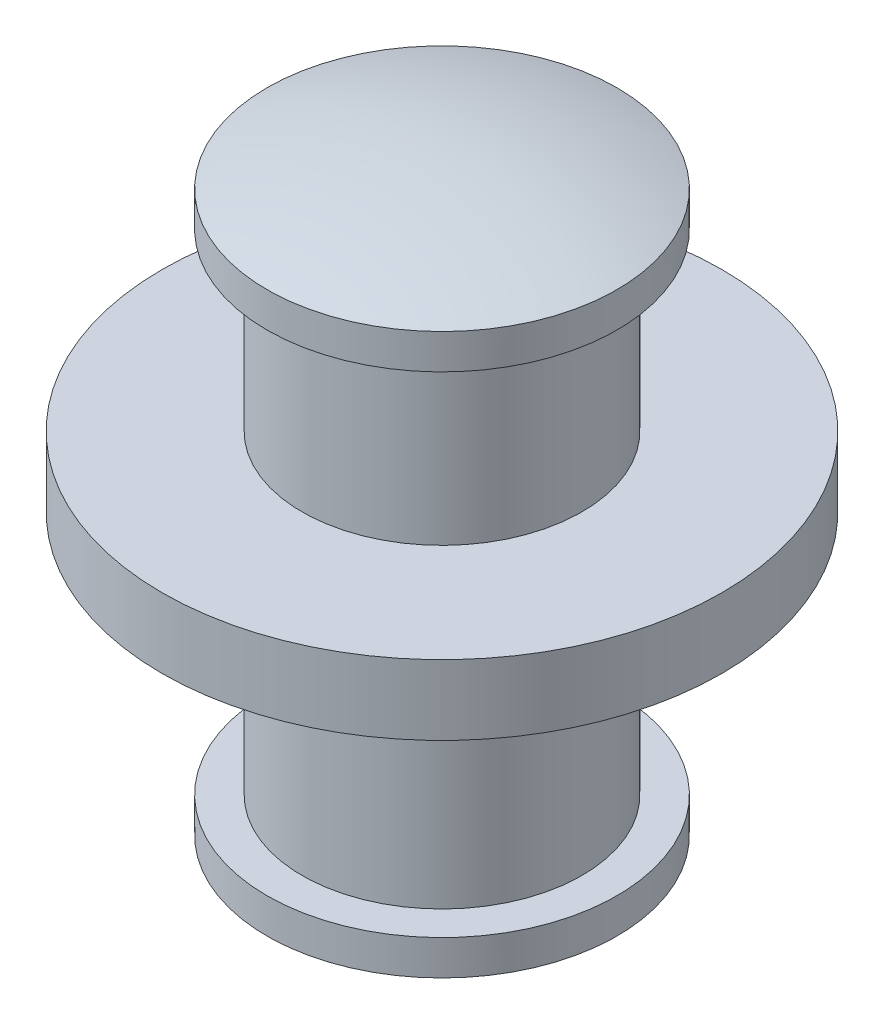
ISO-10303-21;
HEADER;
FILE_DESCRIPTION(('STEP AP214'),'2;1');
FILE_NAME('part.step','',(''),(''),'','','');
FILE_SCHEMA(('AUTOMOTIVE_DESIGN { 1 0 10303 214 1 1 1 1 }'));
ENDSEC;
DATA;
#1=APPLICATION_CONTEXT('core data for automotive mechanical design processes');
#2=APPLICATION_PROTOCOL_DEFINITION('international standard','automotive_design',2000,#1);
#3=PRODUCT_CONTEXT('',#1,'mechanical');
#4=PRODUCT('Part','Part','',(#3));
#5=PRODUCT_RELATED_PRODUCT_CATEGORY('part','',(#4));
#6=PRODUCT_DEFINITION_FORMATION('','',#4);
#7=PRODUCT_DEFINITION_CONTEXT('part definition',#1,'design');
#8=PRODUCT_DEFINITION('design','',#6,#7);
#9=PRODUCT_DEFINITION_SHAPE('','',#8);
#10=(LENGTH_UNIT() NAMED_UNIT(*) SI_UNIT(.MILLI.,.METRE.));
#11=(NAMED_UNIT(*) PLANE_ANGLE_UNIT() SI_UNIT($,.RADIAN.));
#12=(NAMED_UNIT(*) SI_UNIT($,.STERADIAN.) SOLID_ANGLE_UNIT());
#13=UNCERTAINTY_MEASURE_WITH_UNIT(LENGTH_MEASURE(1.E-05),#10,'distance_accuracy_value','');
#14=(GEOMETRIC_REPRESENTATION_CONTEXT(3) GLOBAL_UNCERTAINTY_ASSIGNED_CONTEXT((#13)) GLOBAL_UNIT_ASSIGNED_CONTEXT((#10,
#11,#12)) REPRESENTATION_CONTEXT('',''));
#15=CARTESIAN_POINT('',(0.,0.,0.));
#16=DIRECTION('',(0.,0.,1.));
#17=DIRECTION('',(1.,0.,0.));
#18=AXIS2_PLACEMENT_3D('',#15,#16,#17);
#19=CARTESIAN_POINT('',(0.,0.845081236566722,0.));
#20=DIRECTION('',(0.,-1.,0.));
#21=DIRECTION('',(-1.,0.,0.));
#22=AXIS2_PLACEMENT_3D('',#19,#20,#21);
#23=SPHERICAL_SURFACE('',#22,15.9584323392451);
#24=CARTESIAN_POINT('',(0.,16.,0.));
#25=DIRECTION('',(0.,-1.,0.));
#26=DIRECTION('',(0.,0.,-1.));
#27=AXIS2_PLACEMENT_3D('',#24,#25,#26);
#28=CIRCLE('',#27,5.);
#29=CARTESIAN_POINT('',(0.,16.,-5.));
#30=VERTEX_POINT('',#29);
#31=EDGE_CURVE('E67',#30,#30,#28,.T.);
#32=ORIENTED_EDGE('',*,*,#31,.F.);
#33=EDGE_LOOP('',(#32));
#34=FACE_BOUND('',#33,.T.);
#35=ADVANCED_FACE('F33',(#34),#23,.T.);
#36=CARTESIAN_POINT('',(0.,18.8923845601452,0.));
#37=DIRECTION('',(0.,-1.,0.));
#38=DIRECTION('',(-1.,0.,0.));
#39=AXIS2_PLACEMENT_3D('',#36,#37,#38);
#40=SPHERICAL_SURFACE('',#39,19.5428297431158);
#41=CARTESIAN_POINT('',(0.,0.,0.));
#42=DIRECTION('',(0.,-1.,0.));
#43=DIRECTION('',(0.,0.,-1.));
#44=AXIS2_PLACEMENT_3D('',#41,#42,#43);
#45=CIRCLE('',#44,5.00000000000001);
#46=CARTESIAN_POINT('',(0.,0.,-5.00000000000001));
#47=VERTEX_POINT('',#46);
#48=EDGE_CURVE('E10',#47,#47,#45,.T.);
#49=ORIENTED_EDGE('',*,*,#48,.T.);
#50=EDGE_LOOP('',(#49));
#51=FACE_BOUND('',#50,.T.);
#52=ADVANCED_FACE('F74',(#51),#40,.T.);
#53=CARTESIAN_POINT('',(0.,0.,0.));
#54=DIRECTION('',(0.,-1.,0.));
#55=DIRECTION('',(0.,0.,-1.));
#56=AXIS2_PLACEMENT_3D('',#53,#54,#55);
#57=CYLINDRICAL_SURFACE('',#56,5.00000000000001);
#58=ORIENTED_EDGE('',*,*,#48,.F.);
#59=EDGE_LOOP('',(#58));
#60=FACE_BOUND('',#59,.T.);
#61=CARTESIAN_POINT('',(0.,1.,0.));
#62=DIRECTION('',(0.,-1.,0.));
#63=DIRECTION('',(0.,0.,-1.));
#64=AXIS2_PLACEMENT_3D('',#61,#62,#63);
#65=CIRCLE('',#64,5.00000000000001);
#66=CARTESIAN_POINT('',(0.,1.,-5.00000000000001));
#67=VERTEX_POINT('',#66);
#68=EDGE_CURVE('E39',#67,#67,#65,.T.);
#69=ORIENTED_EDGE('',*,*,#68,.T.);
#70=EDGE_LOOP('',(#69));
#71=FACE_BOUND('',#70,.T.);
#72=ADVANCED_FACE('F78',(#60,#71),#57,.T.);
#73=CARTESIAN_POINT('',(-4.,1.,0.));
#74=DIRECTION('',(0.,-1.,0.));
#75=DIRECTION('',(0.,0.,-1.));
#76=AXIS2_PLACEMENT_3D('',#73,#74,#75);
#77=PLANE('',#76);
#78=ORIENTED_EDGE('',*,*,#68,.F.);
#79=EDGE_LOOP('',(#78));
#80=FACE_BOUND('',#79,.T.);
#81=CARTESIAN_POINT('',(0.,1.,0.));
#82=DIRECTION('',(0.,-1.,0.));
#83=DIRECTION('',(0.,0.,-1.));
#84=AXIS2_PLACEMENT_3D('',#81,#82,#83);
#85=CIRCLE('',#84,4.);
#86=CARTESIAN_POINT('',(0.,1.,-4.));
#87=VERTEX_POINT('',#86);
#88=EDGE_CURVE('E43',#87,#87,#85,.T.);
#89=ORIENTED_EDGE('',*,*,#88,.T.);
#90=EDGE_LOOP('',(#89));
#91=FACE_BOUND('',#90,.T.);
#92=ADVANCED_FACE('F82',(#80,#91),#77,.F.);
#93=CARTESIAN_POINT('',(0.,0.,0.));
#94=DIRECTION('',(0.,-1.,0.));
#95=DIRECTION('',(0.,0.,-1.));
#96=AXIS2_PLACEMENT_3D('',#93,#94,#95);
#97=CYLINDRICAL_SURFACE('',#96,4.);
#98=ORIENTED_EDGE('',*,*,#88,.F.);
#99=EDGE_LOOP('',(#98));
#100=FACE_BOUND('',#99,.T.);
#101=CARTESIAN_POINT('',(0.,8.00000000000001,0.));
#102=DIRECTION('',(0.,-1.,0.));
#103=DIRECTION('',(0.,0.,-1.));
#104=AXIS2_PLACEMENT_3D('',#101,#102,#103);
#105=CIRCLE('',#104,4.);
#106=CARTESIAN_POINT('',(0.,8.00000000000001,-4.));
#107=VERTEX_POINT('',#106);
#108=EDGE_CURVE('E47',#107,#107,#105,.T.);
#109=ORIENTED_EDGE('',*,*,#108,.T.);
#110=EDGE_LOOP('',(#109));
#111=FACE_BOUND('',#110,.T.);
#112=ADVANCED_FACE('F88',(#100,#111),#97,.T.);
#113=CARTESIAN_POINT('',(-8.,8.00000000000001,0.));
#114=DIRECTION('',(0.,1.,0.));
#115=DIRECTION('',(0.,0.,1.));
#116=AXIS2_PLACEMENT_3D('',#113,#114,#115);
#117=PLANE('',#116);
#118=ORIENTED_EDGE('',*,*,#108,.F.);
#119=EDGE_LOOP('',(#118));
#120=FACE_BOUND('',#119,.T.);
#121=CARTESIAN_POINT('',(0.,8.00000000000001,0.));
#122=DIRECTION('',(0.,-1.,0.));
#123=DIRECTION('',(0.,0.,-1.));
#124=AXIS2_PLACEMENT_3D('',#121,#122,#123);
#125=CIRCLE('',#124,8.);
#126=CARTESIAN_POINT('',(0.,8.00000000000001,-8.));
#127=VERTEX_POINT('',#126);
#128=EDGE_CURVE('E52',#127,#127,#125,.T.);
#129=ORIENTED_EDGE('',*,*,#128,.T.);
#130=EDGE_LOOP('',(#129));
#131=FACE_BOUND('',#130,.T.);
#132=ADVANCED_FACE('F92',(#120,#131),#117,.F.);
#133=CARTESIAN_POINT('',(0.,0.,0.));
#134=DIRECTION('',(0.,-1.,0.));
#135=DIRECTION('',(0.,0.,-1.));
#136=AXIS2_PLACEMENT_3D('',#133,#134,#135);
#137=CYLINDRICAL_SURFACE('',#136,8.);
#138=ORIENTED_EDGE('',*,*,#128,.F.);
#139=EDGE_LOOP('',(#138));
#140=FACE_BOUND('',#139,.T.);
#141=CARTESIAN_POINT('',(0.,10.,0.));
#142=DIRECTION('',(0.,-1.,0.));
#143=DIRECTION('',(0.,0.,-1.));
#144=AXIS2_PLACEMENT_3D('',#141,#142,#143);
#145=CIRCLE('',#144,8.);
#146=CARTESIAN_POINT('',(0.,10.,-8.));
#147=VERTEX_POINT('',#146);
#148=EDGE_CURVE('E55',#147,#147,#145,.T.);
#149=ORIENTED_EDGE('',*,*,#148,.T.);
#150=EDGE_LOOP('',(#149));
#151=FACE_BOUND('',#150,.T.);
#152=ADVANCED_FACE('F96',(#140,#151),#137,.T.);
#153=CARTESIAN_POINT('',(-8.,10.,0.));
#154=DIRECTION('',(0.,-1.,0.));
#155=DIRECTION('',(0.,0.,-1.));
#156=AXIS2_PLACEMENT_3D('',#153,#154,#155);
#157=PLANE('',#156);
#158=ORIENTED_EDGE('',*,*,#148,.F.);
#159=EDGE_LOOP('',(#158));
#160=FACE_BOUND('',#159,.T.);
#161=CARTESIAN_POINT('',(0.,10.,0.));
#162=DIRECTION('',(0.,-1.,0.));
#163=DIRECTION('',(0.,0.,-1.));
#164=AXIS2_PLACEMENT_3D('',#161,#162,#163);
#165=CIRCLE('',#164,4.);
#166=CARTESIAN_POINT('',(0.,10.,-4.));
#167=VERTEX_POINT('',#166);
#168=EDGE_CURVE('E58',#167,#167,#165,.T.);
#169=ORIENTED_EDGE('',*,*,#168,.T.);
#170=EDGE_LOOP('',(#169));
#171=FACE_BOUND('',#170,.T.);
#172=ADVANCED_FACE('F100',(#160,#171),#157,.F.);
#173=CARTESIAN_POINT('',(0.,0.,0.));
#174=DIRECTION('',(0.,-1.,0.));
#175=DIRECTION('',(0.,0.,-1.));
#176=AXIS2_PLACEMENT_3D('',#173,#174,#175);
#177=CYLINDRICAL_SURFACE('',#176,4.);
#178=ORIENTED_EDGE('',*,*,#168,.F.);
#179=EDGE_LOOP('',(#178));
#180=FACE_BOUND('',#179,.T.);
#181=CARTESIAN_POINT('',(0.,15.,0.));
#182=DIRECTION('',(0.,-1.,0.));
#183=DIRECTION('',(0.,0.,-1.));
#184=AXIS2_PLACEMENT_3D('',#181,#182,#183);
#185=CIRCLE('',#184,4.);
#186=CARTESIAN_POINT('',(0.,15.,-4.));
#187=VERTEX_POINT('',#186);
#188=EDGE_CURVE('E61',#187,#187,#185,.T.);
#189=ORIENTED_EDGE('',*,*,#188,.T.);
#190=EDGE_LOOP('',(#189));
#191=FACE_BOUND('',#190,.T.);
#192=ADVANCED_FACE('F104',(#180,#191),#177,.T.);
#193=CARTESIAN_POINT('',(-5.,15.,0.));
#194=DIRECTION('',(0.,1.,0.));
#195=DIRECTION('',(0.,0.,1.));
#196=AXIS2_PLACEMENT_3D('',#193,#194,#195);
#197=PLANE('',#196);
#198=ORIENTED_EDGE('',*,*,#188,.F.);
#199=EDGE_LOOP('',(#198));
#200=FACE_BOUND('',#199,.T.);
#201=CARTESIAN_POINT('',(0.,15.,0.));
#202=DIRECTION('',(0.,-1.,0.));
#203=DIRECTION('',(0.,0.,-1.));
#204=AXIS2_PLACEMENT_3D('',#201,#202,#203);
#205=CIRCLE('',#204,5.);
#206=CARTESIAN_POINT('',(0.,15.,-5.));
#207=VERTEX_POINT('',#206);
#208=EDGE_CURVE('E64',#207,#207,#205,.T.);
#209=ORIENTED_EDGE('',*,*,#208,.T.);
#210=EDGE_LOOP('',(#209));
#211=FACE_BOUND('',#210,.T.);
#212=ADVANCED_FACE('F108',(#200,#211),#197,.F.);
#213=CARTESIAN_POINT('',(0.,0.,0.));
#214=DIRECTION('',(0.,-1.,0.));
#215=DIRECTION('',(0.,0.,-1.));
#216=AXIS2_PLACEMENT_3D('',#213,#214,#215);
#217=CYLINDRICAL_SURFACE('',#216,5.);
#218=ORIENTED_EDGE('',*,*,#208,.F.);
#219=EDGE_LOOP('',(#218));
#220=FACE_BOUND('',#219,.T.);
#221=ORIENTED_EDGE('',*,*,#31,.T.);
#222=EDGE_LOOP('',(#221));
#223=FACE_BOUND('',#222,.T.);
#224=ADVANCED_FACE('F71',(#220,#223),#217,.T.);
#225=CLOSED_SHELL('',(#35,#52,#72,#92,#112,#132,#152,#172,#192,#212,#224));
#226=MANIFOLD_SOLID_BREP('B2',#225);
#227=ADVANCED_BREP_SHAPE_REPRESENTATION('',(#18,#226),#14);
#228=SHAPE_DEFINITION_REPRESENTATION(#9,#227);
ENDSEC;
END-ISO-10303-21;
